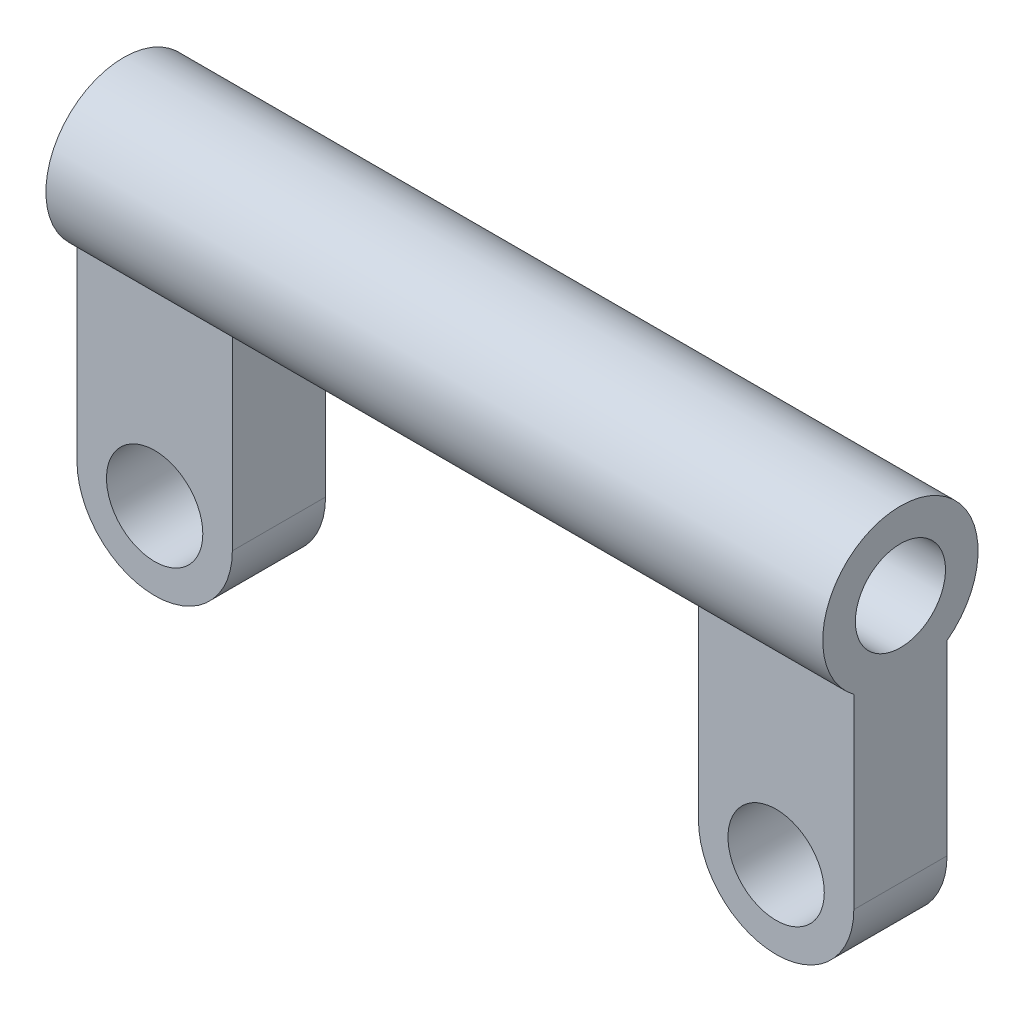
ISO-10303-21;
HEADER;
FILE_DESCRIPTION(('STEP AP214'),'2;1');
FILE_NAME('part.step','',(''),(''),'','','');
FILE_SCHEMA(('AUTOMOTIVE_DESIGN { 1 0 10303 214 1 1 1 1 }'));
ENDSEC;
DATA;
#1=APPLICATION_CONTEXT('core data for automotive mechanical design processes');
#2=APPLICATION_PROTOCOL_DEFINITION('international standard','automotive_design',2000,#1);
#3=PRODUCT_CONTEXT('',#1,'mechanical');
#4=PRODUCT('Part','Part','',(#3));
#5=PRODUCT_RELATED_PRODUCT_CATEGORY('part','',(#4));
#6=PRODUCT_DEFINITION_FORMATION('','',#4);
#7=PRODUCT_DEFINITION_CONTEXT('part definition',#1,'design');
#8=PRODUCT_DEFINITION('design','',#6,#7);
#9=PRODUCT_DEFINITION_SHAPE('','',#8);
#10=(LENGTH_UNIT() NAMED_UNIT(*) SI_UNIT(.MILLI.,.METRE.));
#11=(NAMED_UNIT(*) PLANE_ANGLE_UNIT() SI_UNIT($,.RADIAN.));
#12=(NAMED_UNIT(*) SI_UNIT($,.STERADIAN.) SOLID_ANGLE_UNIT());
#13=UNCERTAINTY_MEASURE_WITH_UNIT(LENGTH_MEASURE(1.E-05),#10,'distance_accuracy_value','');
#14=(GEOMETRIC_REPRESENTATION_CONTEXT(3) GLOBAL_UNCERTAINTY_ASSIGNED_CONTEXT((#13)) GLOBAL_UNIT_ASSIGNED_CONTEXT((#10,
#11,#12)) REPRESENTATION_CONTEXT('',''));
#15=CARTESIAN_POINT('',(0.,0.,0.));
#16=DIRECTION('',(0.,0.,1.));
#17=DIRECTION('',(1.,0.,0.));
#18=AXIS2_PLACEMENT_3D('',#15,#16,#17);
#19=CARTESIAN_POINT('',(19.5710678118655,8.,0.));
#20=DIRECTION('',(-1.,0.,0.));
#21=DIRECTION('',(0.,0.,1.));
#22=AXIS2_PLACEMENT_3D('',#19,#20,#21);
#23=CYLINDRICAL_SURFACE('',#22,2.5);
#24=DIRECTION('',(-1.,0.,0.));
#25=VECTOR('',#24,1.);
#26=CARTESIAN_POINT('',(19.5710678118655,6.,1.5));
#27=LINE('',#26,#25);
#28=CARTESIAN_POINT('',(12.5,6.,1.5));
#29=VERTEX_POINT('',#28);
#30=CARTESIAN_POINT('',(7.50000000000001,6.,1.5));
#31=VERTEX_POINT('',#30);
#32=EDGE_CURVE('E168',#29,#31,#27,.T.);
#33=ORIENTED_EDGE('',*,*,#32,.F.);
#34=CARTESIAN_POINT('',(12.5,8.,0.));
#35=DIRECTION('',(-1.,0.,0.));
#36=DIRECTION('',(0.,0.,1.));
#37=AXIS2_PLACEMENT_3D('',#34,#35,#36);
#38=CIRCLE('',#37,2.5);
#39=CARTESIAN_POINT('',(12.5,6.,-1.5));
#40=VERTEX_POINT('',#39);
#41=EDGE_CURVE('E155',#40,#29,#38,.F.);
#42=ORIENTED_EDGE('',*,*,#41,.F.);
#43=DIRECTION('',(-1.,0.,0.));
#44=VECTOR('',#43,1.);
#45=CARTESIAN_POINT('',(19.5710678118655,6.,-1.5));
#46=LINE('',#45,#44);
#47=CARTESIAN_POINT('',(7.50000000000001,6.,-1.5));
#48=VERTEX_POINT('',#47);
#49=EDGE_CURVE('E164',#40,#48,#46,.T.);
#50=ORIENTED_EDGE('',*,*,#49,.T.);
#51=CARTESIAN_POINT('',(7.50000000000001,8.,0.));
#52=DIRECTION('',(1.,0.,0.));
#53=DIRECTION('',(0.,0.,-1.));
#54=AXIS2_PLACEMENT_3D('',#51,#52,#53);
#55=CIRCLE('',#54,2.5);
#56=EDGE_CURVE('E161',#31,#48,#55,.T.);
#57=ORIENTED_EDGE('',*,*,#56,.F.);
#58=EDGE_LOOP('',(#33,#42,#50,#57));
#59=FACE_BOUND('',#58,.T.);
#60=CARTESIAN_POINT('',(-12.5,8.,0.));
#61=DIRECTION('',(-1.,0.,0.));
#62=DIRECTION('',(0.,0.,1.));
#63=AXIS2_PLACEMENT_3D('',#60,#61,#62);
#64=CIRCLE('',#63,2.5);
#65=CARTESIAN_POINT('',(-12.5,6.,1.5));
#66=VERTEX_POINT('',#65);
#67=CARTESIAN_POINT('',(-12.5,6.,-1.5));
#68=VERTEX_POINT('',#67);
#69=EDGE_CURVE('E139',#66,#68,#64,.T.);
#70=ORIENTED_EDGE('',*,*,#69,.F.);
#71=DIRECTION('',(-1.,0.,0.));
#72=VECTOR('',#71,1.);
#73=CARTESIAN_POINT('',(19.5710678118655,6.,1.5));
#74=LINE('',#73,#72);
#75=CARTESIAN_POINT('',(-7.49999999999999,6.,1.5));
#76=VERTEX_POINT('',#75);
#77=EDGE_CURVE('E143',#66,#76,#74,.F.);
#78=ORIENTED_EDGE('',*,*,#77,.T.);
#79=CARTESIAN_POINT('',(-7.49999999999999,8.,0.));
#80=DIRECTION('',(-1.,0.,0.));
#81=DIRECTION('',(0.,0.,1.));
#82=AXIS2_PLACEMENT_3D('',#79,#80,#81);
#83=CIRCLE('',#82,2.5);
#84=CARTESIAN_POINT('',(-7.49999999999999,6.,-1.5));
#85=VERTEX_POINT('',#84);
#86=EDGE_CURVE('E141',#76,#85,#83,.F.);
#87=ORIENTED_EDGE('',*,*,#86,.T.);
#88=DIRECTION('',(-1.,0.,0.));
#89=VECTOR('',#88,1.);
#90=CARTESIAN_POINT('',(19.5710678118655,6.,-1.5));
#91=LINE('',#90,#89);
#92=EDGE_CURVE('E127',#68,#85,#91,.F.);
#93=ORIENTED_EDGE('',*,*,#92,.F.);
#94=EDGE_LOOP('',(#70,#78,#87,#93));
#95=FACE_BOUND('',#94,.T.);
#96=ADVANCED_FACE('F43',(#59,#95),#23,.T.);
#97=CARTESIAN_POINT('',(19.5710678118655,8.,0.));
#98=DIRECTION('',(-1.,0.,0.));
#99=DIRECTION('',(0.,0.,1.));
#100=AXIS2_PLACEMENT_3D('',#97,#98,#99);
#101=CYLINDRICAL_SURFACE('',#100,1.45);
#102=CARTESIAN_POINT('',(12.5,8.,0.));
#103=DIRECTION('',(-1.,0.,0.));
#104=DIRECTION('',(0.,0.,1.));
#105=AXIS2_PLACEMENT_3D('',#102,#103,#104);
#106=CIRCLE('',#105,1.45);
#107=CARTESIAN_POINT('',(12.5,8.,1.45));
#108=VERTEX_POINT('',#107);
#109=EDGE_CURVE('E149',#108,#108,#106,.F.);
#110=ORIENTED_EDGE('',*,*,#109,.T.);
#111=EDGE_LOOP('',(#110));
#112=FACE_BOUND('',#111,.T.);
#113=CARTESIAN_POINT('',(-12.5,8.,0.));
#114=DIRECTION('',(-1.,0.,0.));
#115=DIRECTION('',(0.,0.,1.));
#116=AXIS2_PLACEMENT_3D('',#113,#114,#115);
#117=CIRCLE('',#116,1.45);
#118=CARTESIAN_POINT('',(-12.5,8.,1.45));
#119=VERTEX_POINT('',#118);
#120=EDGE_CURVE('E150',#119,#119,#117,.T.);
#121=ORIENTED_EDGE('',*,*,#120,.T.);
#122=EDGE_LOOP('',(#121));
#123=FACE_BOUND('',#122,.T.);
#124=ADVANCED_FACE('F249',(#112,#123),#101,.F.);
#125=CARTESIAN_POINT('',(0.,0.,1.5));
#126=DIRECTION('',(0.,0.,-1.));
#127=DIRECTION('',(-1.,0.,0.));
#128=AXIS2_PLACEMENT_3D('',#125,#126,#127);
#129=PLANE('',#128);
#130=DIRECTION('',(0.,-1.,0.));
#131=VECTOR('',#130,1.);
#132=CARTESIAN_POINT('',(7.50000000000001,-2.5,1.5));
#133=LINE('',#132,#131);
#134=CARTESIAN_POINT('',(7.50000000000001,0.,1.5));
#135=VERTEX_POINT('',#134);
#136=EDGE_CURVE('E180',#31,#135,#133,.T.);
#137=ORIENTED_EDGE('',*,*,#136,.T.);
#138=CARTESIAN_POINT('',(10.,0.,1.5));
#139=DIRECTION('',(0.,0.,-1.));
#140=DIRECTION('',(-1.,0.,0.));
#141=AXIS2_PLACEMENT_3D('',#138,#139,#140);
#142=CIRCLE('',#141,2.5);
#143=CARTESIAN_POINT('',(10.,-2.5,1.5));
#144=VERTEX_POINT('',#143);
#145=EDGE_CURVE('E206',#135,#144,#142,.F.);
#146=ORIENTED_EDGE('',*,*,#145,.T.);
#147=CARTESIAN_POINT('',(10.,0.,1.5));
#148=DIRECTION('',(0.,0.,-1.));
#149=DIRECTION('',(-1.,0.,0.));
#150=AXIS2_PLACEMENT_3D('',#147,#148,#149);
#151=CIRCLE('',#150,2.5);
#152=CARTESIAN_POINT('',(12.5,0.,1.5));
#153=VERTEX_POINT('',#152);
#154=EDGE_CURVE('E203',#144,#153,#151,.F.);
#155=ORIENTED_EDGE('',*,*,#154,.T.);
#156=DIRECTION('',(0.,1.,0.));
#157=VECTOR('',#156,1.);
#158=CARTESIAN_POINT('',(12.5,-2.5,1.5));
#159=LINE('',#158,#157);
#160=EDGE_CURVE('E184',#153,#29,#159,.T.);
#161=ORIENTED_EDGE('',*,*,#160,.T.);
#162=ORIENTED_EDGE('',*,*,#32,.T.);
#163=EDGE_LOOP('',(#137,#146,#155,#161,#162));
#164=FACE_BOUND('',#163,.T.);
#165=CARTESIAN_POINT('',(10.,0.,1.5));
#166=DIRECTION('',(0.,0.,1.));
#167=DIRECTION('',(1.,0.,0.));
#168=AXIS2_PLACEMENT_3D('',#165,#166,#167);
#169=CIRCLE('',#168,1.55);
#170=CARTESIAN_POINT('',(11.55,0.,1.5));
#171=VERTEX_POINT('',#170);
#172=EDGE_CURVE('E172',#171,#171,#169,.T.);
#173=ORIENTED_EDGE('',*,*,#172,.F.);
#174=EDGE_LOOP('',(#173));
#175=FACE_BOUND('',#174,.T.);
#176=ADVANCED_FACE('F255',(#164,#175),#129,.F.);
#177=CARTESIAN_POINT('',(0.,0.,-1.5));
#178=DIRECTION('',(0.,0.,-1.));
#179=DIRECTION('',(-1.,0.,0.));
#180=AXIS2_PLACEMENT_3D('',#177,#178,#179);
#181=PLANE('',#180);
#182=CARTESIAN_POINT('',(10.,0.,-1.5));
#183=DIRECTION('',(0.,0.,-1.));
#184=DIRECTION('',(-1.,0.,0.));
#185=AXIS2_PLACEMENT_3D('',#182,#183,#184);
#186=CIRCLE('',#185,2.5);
#187=CARTESIAN_POINT('',(12.5,0.,-1.5));
#188=VERTEX_POINT('',#187);
#189=CARTESIAN_POINT('',(10.,-2.5,-1.5));
#190=VERTEX_POINT('',#189);
#191=EDGE_CURVE('E188',#188,#190,#186,.T.);
#192=ORIENTED_EDGE('',*,*,#191,.T.);
#193=CARTESIAN_POINT('',(10.,0.,-1.5));
#194=DIRECTION('',(0.,0.,-1.));
#195=DIRECTION('',(-1.,0.,0.));
#196=AXIS2_PLACEMENT_3D('',#193,#194,#195);
#197=CIRCLE('',#196,2.5);
#198=CARTESIAN_POINT('',(7.50000000000001,0.,-1.5));
#199=VERTEX_POINT('',#198);
#200=EDGE_CURVE('E196',#190,#199,#197,.T.);
#201=ORIENTED_EDGE('',*,*,#200,.T.);
#202=DIRECTION('',(0.,-1.,0.));
#203=VECTOR('',#202,1.);
#204=CARTESIAN_POINT('',(7.50000000000001,-2.5,-1.5));
#205=LINE('',#204,#203);
#206=EDGE_CURVE('E176',#48,#199,#205,.T.);
#207=ORIENTED_EDGE('',*,*,#206,.F.);
#208=ORIENTED_EDGE('',*,*,#49,.F.);
#209=DIRECTION('',(0.,1.,0.));
#210=VECTOR('',#209,1.);
#211=CARTESIAN_POINT('',(12.5,-2.5,-1.5));
#212=LINE('',#211,#210);
#213=EDGE_CURVE('E185',#188,#40,#212,.T.);
#214=ORIENTED_EDGE('',*,*,#213,.F.);
#215=EDGE_LOOP('',(#192,#201,#207,#208,#214));
#216=FACE_BOUND('',#215,.T.);
#217=CARTESIAN_POINT('',(10.,0.,-1.5));
#218=DIRECTION('',(0.,0.,1.));
#219=DIRECTION('',(1.,0.,0.));
#220=AXIS2_PLACEMENT_3D('',#217,#218,#219);
#221=CIRCLE('',#220,1.55);
#222=CARTESIAN_POINT('',(11.55,0.,-1.5));
#223=VERTEX_POINT('',#222);
#224=EDGE_CURVE('E171',#223,#223,#221,.T.);
#225=ORIENTED_EDGE('',*,*,#224,.T.);
#226=EDGE_LOOP('',(#225));
#227=FACE_BOUND('',#226,.T.);
#228=ADVANCED_FACE('F268',(#216,#227),#181,.T.);
#229=CARTESIAN_POINT('',(7.50000000000001,-2.5,1.5));
#230=DIRECTION('',(1.,0.,0.));
#231=DIRECTION('',(0.,0.,-1.));
#232=AXIS2_PLACEMENT_3D('',#229,#230,#231);
#233=PLANE('',#232);
#234=ORIENTED_EDGE('',*,*,#206,.T.);
#235=DIRECTION('',(0.,0.,-1.));
#236=VECTOR('',#235,1.);
#237=CARTESIAN_POINT('',(7.50000000000001,0.,1.5));
#238=LINE('',#237,#236);
#239=EDGE_CURVE('E199',#199,#135,#238,.F.);
#240=ORIENTED_EDGE('',*,*,#239,.T.);
#241=ORIENTED_EDGE('',*,*,#136,.F.);
#242=ORIENTED_EDGE('',*,*,#56,.T.);
#243=EDGE_LOOP('',(#234,#240,#241,#242));
#244=FACE_BOUND('',#243,.T.);
#245=ADVANCED_FACE('F272',(#244),#233,.F.);
#246=CARTESIAN_POINT('',(12.5,-2.5,1.5));
#247=DIRECTION('',(-1.,0.,0.));
#248=DIRECTION('',(0.,0.,1.));
#249=AXIS2_PLACEMENT_3D('',#246,#247,#248);
#250=PLANE('',#249);
#251=ORIENTED_EDGE('',*,*,#160,.F.);
#252=DIRECTION('',(0.,0.,-1.));
#253=VECTOR('',#252,1.);
#254=CARTESIAN_POINT('',(12.5,0.,1.5));
#255=LINE('',#254,#253);
#256=EDGE_CURVE('E11',#153,#188,#255,.T.);
#257=ORIENTED_EDGE('',*,*,#256,.T.);
#258=ORIENTED_EDGE('',*,*,#213,.T.);
#259=ORIENTED_EDGE('',*,*,#41,.T.);
#260=EDGE_LOOP('',(#251,#257,#258,#259));
#261=FACE_BOUND('',#260,.T.);
#262=ORIENTED_EDGE('',*,*,#109,.F.);
#263=EDGE_LOOP('',(#262));
#264=FACE_BOUND('',#263,.T.);
#265=ADVANCED_FACE('F264',(#261,#264),#250,.F.);
#266=CARTESIAN_POINT('',(10.,0.,1.5));
#267=DIRECTION('',(0.,0.,-1.));
#268=DIRECTION('',(-1.,0.,0.));
#269=AXIS2_PLACEMENT_3D('',#266,#267,#268);
#270=CYLINDRICAL_SURFACE('',#269,1.55);
#271=ORIENTED_EDGE('',*,*,#172,.T.);
#272=EDGE_LOOP('',(#271));
#273=FACE_BOUND('',#272,.T.);
#274=ORIENTED_EDGE('',*,*,#224,.F.);
#275=EDGE_LOOP('',(#274));
#276=FACE_BOUND('',#275,.T.);
#277=ADVANCED_FACE('F261',(#273,#276),#270,.F.);
#278=CARTESIAN_POINT('',(-12.5,8.,0.));
#279=DIRECTION('',(-1.,0.,0.));
#280=DIRECTION('',(0.,0.,1.));
#281=AXIS2_PLACEMENT_3D('',#278,#279,#280);
#282=PLANE('',#281);
#283=ORIENTED_EDGE('',*,*,#120,.F.);
#284=EDGE_LOOP('',(#283));
#285=FACE_BOUND('',#284,.T.);
#286=DIRECTION('',(0.,-1.,0.));
#287=VECTOR('',#286,1.);
#288=CARTESIAN_POINT('',(-12.5,-2.5,-1.5));
#289=LINE('',#288,#287);
#290=CARTESIAN_POINT('',(-12.5,0.,-1.5));
#291=VERTEX_POINT('',#290);
#292=EDGE_CURVE('E122',#68,#291,#289,.T.);
#293=ORIENTED_EDGE('',*,*,#292,.T.);
#294=DIRECTION('',(0.,0.,-1.));
#295=VECTOR('',#294,1.);
#296=CARTESIAN_POINT('',(-12.5,0.,1.5));
#297=LINE('',#296,#295);
#298=CARTESIAN_POINT('',(-12.5,0.,1.5));
#299=VERTEX_POINT('',#298);
#300=EDGE_CURVE('E53',#291,#299,#297,.F.);
#301=ORIENTED_EDGE('',*,*,#300,.T.);
#302=DIRECTION('',(0.,-1.,0.));
#303=VECTOR('',#302,1.);
#304=CARTESIAN_POINT('',(-12.5,-2.5,1.5));
#305=LINE('',#304,#303);
#306=EDGE_CURVE('E147',#66,#299,#305,.T.);
#307=ORIENTED_EDGE('',*,*,#306,.F.);
#308=ORIENTED_EDGE('',*,*,#69,.T.);
#309=EDGE_LOOP('',(#293,#301,#307,#308));
#310=FACE_BOUND('',#309,.T.);
#311=ADVANCED_FACE('F146',(#285,#310),#282,.T.);
#312=CARTESIAN_POINT('',(0.,0.,1.5));
#313=DIRECTION('',(0.,0.,-1.));
#314=DIRECTION('',(-1.,0.,0.));
#315=AXIS2_PLACEMENT_3D('',#312,#313,#314);
#316=PLANE('',#315);
#317=CARTESIAN_POINT('',(-9.99999999999999,0.,1.5));
#318=DIRECTION('',(0.,0.,-1.));
#319=DIRECTION('',(-1.,0.,0.));
#320=AXIS2_PLACEMENT_3D('',#317,#318,#319);
#321=CIRCLE('',#320,2.5);
#322=CARTESIAN_POINT('',(-9.99999999999999,-2.5,1.5));
#323=VERTEX_POINT('',#322);
#324=EDGE_CURVE('E61',#299,#323,#321,.F.);
#325=ORIENTED_EDGE('',*,*,#324,.T.);
#326=CARTESIAN_POINT('',(-9.99999999999999,0.,1.5));
#327=DIRECTION('',(0.,0.,-1.));
#328=DIRECTION('',(-1.,0.,0.));
#329=AXIS2_PLACEMENT_3D('',#326,#327,#328);
#330=CIRCLE('',#329,2.5);
#331=CARTESIAN_POINT('',(-7.49999999999999,0.,1.5));
#332=VERTEX_POINT('',#331);
#333=EDGE_CURVE('E220',#323,#332,#330,.F.);
#334=ORIENTED_EDGE('',*,*,#333,.T.);
#335=DIRECTION('',(0.,1.,0.));
#336=VECTOR('',#335,1.);
#337=CARTESIAN_POINT('',(-7.49999999999999,-2.5,1.5));
#338=LINE('',#337,#336);
#339=EDGE_CURVE('E227',#332,#76,#338,.T.);
#340=ORIENTED_EDGE('',*,*,#339,.T.);
#341=ORIENTED_EDGE('',*,*,#77,.F.);
#342=ORIENTED_EDGE('',*,*,#306,.T.);
#343=EDGE_LOOP('',(#325,#334,#340,#341,#342));
#344=FACE_BOUND('',#343,.T.);
#345=CARTESIAN_POINT('',(-9.99999999999999,0.,1.5));
#346=DIRECTION('',(0.,0.,1.));
#347=DIRECTION('',(1.,0.,0.));
#348=AXIS2_PLACEMENT_3D('',#345,#346,#347);
#349=CIRCLE('',#348,1.55);
#350=CARTESIAN_POINT('',(-8.44999999999999,0.,1.5));
#351=VERTEX_POINT('',#350);
#352=EDGE_CURVE('E133',#351,#351,#349,.T.);
#353=ORIENTED_EDGE('',*,*,#352,.F.);
#354=EDGE_LOOP('',(#353));
#355=FACE_BOUND('',#354,.T.);
#356=ADVANCED_FACE('F318',(#344,#355),#316,.F.);
#357=CARTESIAN_POINT('',(0.,0.,-1.5));
#358=DIRECTION('',(0.,0.,-1.));
#359=DIRECTION('',(-1.,0.,0.));
#360=AXIS2_PLACEMENT_3D('',#357,#358,#359);
#361=PLANE('',#360);
#362=DIRECTION('',(0.,1.,0.));
#363=VECTOR('',#362,1.);
#364=CARTESIAN_POINT('',(-7.49999999999999,-2.5,-1.5));
#365=LINE('',#364,#363);
#366=CARTESIAN_POINT('',(-7.49999999999999,0.,-1.5));
#367=VERTEX_POINT('',#366);
#368=EDGE_CURVE('E134',#367,#85,#365,.T.);
#369=ORIENTED_EDGE('',*,*,#368,.F.);
#370=CARTESIAN_POINT('',(-9.99999999999999,0.,-1.5));
#371=DIRECTION('',(0.,0.,-1.));
#372=DIRECTION('',(-1.,0.,0.));
#373=AXIS2_PLACEMENT_3D('',#370,#371,#372);
#374=CIRCLE('',#373,2.5);
#375=CARTESIAN_POINT('',(-9.99999999999999,-2.5,-1.5));
#376=VERTEX_POINT('',#375);
#377=EDGE_CURVE('E215',#367,#376,#374,.T.);
#378=ORIENTED_EDGE('',*,*,#377,.T.);
#379=CARTESIAN_POINT('',(-9.99999999999999,0.,-1.5));
#380=DIRECTION('',(0.,0.,-1.));
#381=DIRECTION('',(-1.,0.,0.));
#382=AXIS2_PLACEMENT_3D('',#379,#380,#381);
#383=CIRCLE('',#382,2.5);
#384=EDGE_CURVE('E130',#376,#291,#383,.T.);
#385=ORIENTED_EDGE('',*,*,#384,.T.);
#386=ORIENTED_EDGE('',*,*,#292,.F.);
#387=ORIENTED_EDGE('',*,*,#92,.T.);
#388=EDGE_LOOP('',(#369,#378,#385,#386,#387));
#389=FACE_BOUND('',#388,.T.);
#390=CARTESIAN_POINT('',(-9.99999999999999,0.,-1.5));
#391=DIRECTION('',(0.,0.,1.));
#392=DIRECTION('',(1.,0.,0.));
#393=AXIS2_PLACEMENT_3D('',#390,#391,#392);
#394=CIRCLE('',#393,1.55);
#395=CARTESIAN_POINT('',(-8.44999999999999,0.,-1.5));
#396=VERTEX_POINT('',#395);
#397=EDGE_CURVE('E144',#396,#396,#394,.T.);
#398=ORIENTED_EDGE('',*,*,#397,.T.);
#399=EDGE_LOOP('',(#398));
#400=FACE_BOUND('',#399,.T.);
#401=ADVANCED_FACE('F125',(#389,#400),#361,.T.);
#402=CARTESIAN_POINT('',(-7.49999999999999,-2.5,1.5));
#403=DIRECTION('',(-1.,0.,0.));
#404=DIRECTION('',(0.,0.,1.));
#405=AXIS2_PLACEMENT_3D('',#402,#403,#404);
#406=PLANE('',#405);
#407=ORIENTED_EDGE('',*,*,#339,.F.);
#408=DIRECTION('',(0.,0.,-1.));
#409=VECTOR('',#408,1.);
#410=CARTESIAN_POINT('',(-7.49999999999999,0.,1.5));
#411=LINE('',#410,#409);
#412=EDGE_CURVE('E209',#332,#367,#411,.T.);
#413=ORIENTED_EDGE('',*,*,#412,.T.);
#414=ORIENTED_EDGE('',*,*,#368,.T.);
#415=ORIENTED_EDGE('',*,*,#86,.F.);
#416=EDGE_LOOP('',(#407,#413,#414,#415));
#417=FACE_BOUND('',#416,.T.);
#418=ADVANCED_FACE('F286',(#417),#406,.F.);
#419=CARTESIAN_POINT('',(-9.99999999999999,0.,1.5));
#420=DIRECTION('',(0.,0.,-1.));
#421=DIRECTION('',(-1.,0.,0.));
#422=AXIS2_PLACEMENT_3D('',#419,#420,#421);
#423=CYLINDRICAL_SURFACE('',#422,1.55);
#424=ORIENTED_EDGE('',*,*,#352,.T.);
#425=EDGE_LOOP('',(#424));
#426=FACE_BOUND('',#425,.T.);
#427=ORIENTED_EDGE('',*,*,#397,.F.);
#428=EDGE_LOOP('',(#427));
#429=FACE_BOUND('',#428,.T.);
#430=ADVANCED_FACE('F281',(#426,#429),#423,.F.);
#431=CARTESIAN_POINT('',(10.,0.,1.5));
#432=DIRECTION('',(0.,0.,-1.));
#433=DIRECTION('',(-1.,0.,0.));
#434=AXIS2_PLACEMENT_3D('',#431,#432,#433);
#435=CYLINDRICAL_SURFACE('',#434,2.5);
#436=ORIENTED_EDGE('',*,*,#256,.F.);
#437=ORIENTED_EDGE('',*,*,#154,.F.);
#438=DIRECTION('',(0.,0.,-1.));
#439=VECTOR('',#438,1.);
#440=CARTESIAN_POINT('',(10.,-2.5,1.5));
#441=LINE('',#440,#439);
#442=EDGE_CURVE('E224',#190,#144,#441,.F.);
#443=ORIENTED_EDGE('',*,*,#442,.F.);
#444=ORIENTED_EDGE('',*,*,#191,.F.);
#445=EDGE_LOOP('',(#436,#437,#443,#444));
#446=FACE_BOUND('',#445,.T.);
#447=ADVANCED_FACE('F246',(#446),#435,.T.);
#448=CARTESIAN_POINT('',(10.,0.,1.5));
#449=DIRECTION('',(0.,0.,-1.));
#450=DIRECTION('',(-1.,0.,0.));
#451=AXIS2_PLACEMENT_3D('',#448,#449,#450);
#452=CYLINDRICAL_SURFACE('',#451,2.5);
#453=ORIENTED_EDGE('',*,*,#145,.F.);
#454=ORIENTED_EDGE('',*,*,#239,.F.);
#455=ORIENTED_EDGE('',*,*,#200,.F.);
#456=ORIENTED_EDGE('',*,*,#442,.T.);
#457=EDGE_LOOP('',(#453,#454,#455,#456));
#458=FACE_BOUND('',#457,.T.);
#459=ADVANCED_FACE('F241',(#458),#452,.T.);
#460=CARTESIAN_POINT('',(-9.99999999999999,0.,1.5));
#461=DIRECTION('',(0.,0.,1.));
#462=DIRECTION('',(1.,0.,0.));
#463=AXIS2_PLACEMENT_3D('',#460,#461,#462);
#464=CYLINDRICAL_SURFACE('',#463,2.5);
#465=DIRECTION('',(0.,0.,-1.));
#466=VECTOR('',#465,1.);
#467=CARTESIAN_POINT('',(-9.99999999999999,-2.5,-1.5));
#468=LINE('',#467,#466);
#469=EDGE_CURVE('E47',#323,#376,#468,.T.);
#470=ORIENTED_EDGE('',*,*,#469,.F.);
#471=ORIENTED_EDGE('',*,*,#324,.F.);
#472=ORIENTED_EDGE('',*,*,#300,.F.);
#473=ORIENTED_EDGE('',*,*,#384,.F.);
#474=EDGE_LOOP('',(#470,#471,#472,#473));
#475=FACE_BOUND('',#474,.T.);
#476=ADVANCED_FACE('F45',(#475),#464,.T.);
#477=CARTESIAN_POINT('',(-9.99999999999999,0.,1.5));
#478=DIRECTION('',(0.,0.,-1.));
#479=DIRECTION('',(-1.,0.,0.));
#480=AXIS2_PLACEMENT_3D('',#477,#478,#479);
#481=CYLINDRICAL_SURFACE('',#480,2.5);
#482=ORIENTED_EDGE('',*,*,#333,.F.);
#483=ORIENTED_EDGE('',*,*,#469,.T.);
#484=ORIENTED_EDGE('',*,*,#377,.F.);
#485=ORIENTED_EDGE('',*,*,#412,.F.);
#486=EDGE_LOOP('',(#482,#483,#484,#485));
#487=FACE_BOUND('',#486,.T.);
#488=ADVANCED_FACE('F237',(#487),#481,.T.);
#489=CLOSED_SHELL('',(#96,#124,#176,#228,#245,#265,#277,#311,#356,#401,#418,#430,#447,#459,#476,#488));
#490=MANIFOLD_SOLID_BREP('B2',#489);
#491=ADVANCED_BREP_SHAPE_REPRESENTATION('',(#18,#490),#14);
#492=SHAPE_DEFINITION_REPRESENTATION(#9,#491);
ENDSEC;
END-ISO-10303-21;
